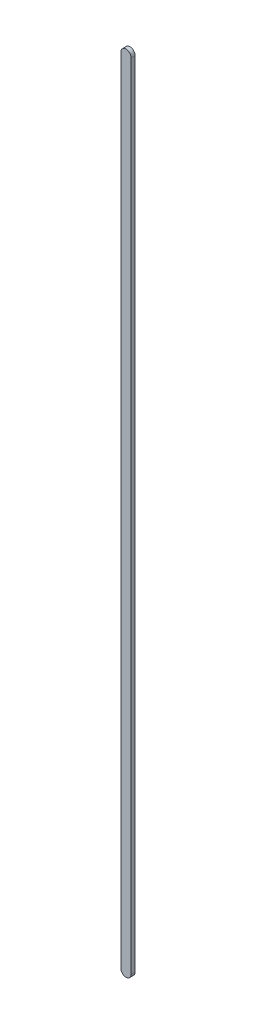
ISO-10303-21;
HEADER;
FILE_DESCRIPTION(('STEP AP214'),'2;1');
FILE_NAME('part.step','',(''),(''),'','','');
FILE_SCHEMA(('AUTOMOTIVE_DESIGN { 1 0 10303 214 1 1 1 1 }'));
ENDSEC;
DATA;
#1=APPLICATION_CONTEXT('core data for automotive mechanical design processes');
#2=APPLICATION_PROTOCOL_DEFINITION('international standard','automotive_design',2000,#1);
#3=PRODUCT_CONTEXT('',#1,'mechanical');
#4=PRODUCT('Part','Part','',(#3));
#5=PRODUCT_RELATED_PRODUCT_CATEGORY('part','',(#4));
#6=PRODUCT_DEFINITION_FORMATION('','',#4);
#7=PRODUCT_DEFINITION_CONTEXT('part definition',#1,'design');
#8=PRODUCT_DEFINITION('design','',#6,#7);
#9=PRODUCT_DEFINITION_SHAPE('','',#8);
#10=(LENGTH_UNIT() NAMED_UNIT(*) SI_UNIT(.MILLI.,.METRE.));
#11=(NAMED_UNIT(*) PLANE_ANGLE_UNIT() SI_UNIT($,.RADIAN.));
#12=(NAMED_UNIT(*) SI_UNIT($,.STERADIAN.) SOLID_ANGLE_UNIT());
#13=UNCERTAINTY_MEASURE_WITH_UNIT(LENGTH_MEASURE(1.E-05),#10,'distance_accuracy_value','');
#14=(GEOMETRIC_REPRESENTATION_CONTEXT(3) GLOBAL_UNCERTAINTY_ASSIGNED_CONTEXT((#13)) GLOBAL_UNIT_ASSIGNED_CONTEXT((#10,
#11,#12)) REPRESENTATION_CONTEXT('',''));
#15=CARTESIAN_POINT('',(0.,0.,0.));
#16=DIRECTION('',(0.,0.,1.));
#17=DIRECTION('',(1.,0.,0.));
#18=AXIS2_PLACEMENT_3D('',#15,#16,#17);
#19=CARTESIAN_POINT('',(86.487,77.724,0.));
#20=DIRECTION('',(-1.,0.,0.));
#21=DIRECTION('',(0.,1.,0.));
#22=AXIS2_PLACEMENT_3D('',#19,#20,#21);
#23=PLANE('',#22);
#24=DIRECTION('',(0.,1.,0.));
#25=VECTOR('',#24,1.);
#26=CARTESIAN_POINT('',(86.487,77.724,0.1999996));
#27=LINE('',#26,#25);
#28=CARTESIAN_POINT('',(86.487,77.724,0.1999996));
#29=VERTEX_POINT('',#28);
#30=CARTESIAN_POINT('',(86.487,117.348,0.1999996));
#31=VERTEX_POINT('',#30);
#32=EDGE_CURVE('E11',#29,#31,#27,.T.);
#33=ORIENTED_EDGE('',*,*,#32,.F.);
#34=DIRECTION('',(0.,0.,1.));
#35=VECTOR('',#34,1.);
#36=CARTESIAN_POINT('',(86.487,77.724,0.));
#37=LINE('',#36,#35);
#38=CARTESIAN_POINT('',(86.487,77.724,0.));
#39=VERTEX_POINT('',#38);
#40=EDGE_CURVE('E24',#39,#29,#37,.T.);
#41=ORIENTED_EDGE('',*,*,#40,.F.);
#42=DIRECTION('',(0.,1.,0.));
#43=VECTOR('',#42,1.);
#44=CARTESIAN_POINT('',(86.487,77.724,0.));
#45=LINE('',#44,#43);
#46=CARTESIAN_POINT('',(86.487,117.348,0.));
#47=VERTEX_POINT('',#46);
#48=EDGE_CURVE('E75',#39,#47,#45,.T.);
#49=ORIENTED_EDGE('',*,*,#48,.T.);
#50=DIRECTION('',(0.,0.,1.));
#51=VECTOR('',#50,1.);
#52=CARTESIAN_POINT('',(86.487,117.348,0.));
#53=LINE('',#52,#51);
#54=EDGE_CURVE('E37',#47,#31,#53,.T.);
#55=ORIENTED_EDGE('',*,*,#54,.T.);
#56=EDGE_LOOP('',(#33,#41,#49,#55));
#57=FACE_BOUND('',#56,.T.);
#58=ADVANCED_FACE('F17',(#57),#23,.F.);
#59=CARTESIAN_POINT('',(86.233,117.348,0.));
#60=DIRECTION('',(0.,0.,-1.));
#61=DIRECTION('',(1.,0.,0.));
#62=AXIS2_PLACEMENT_3D('',#59,#60,#61);
#63=CYLINDRICAL_SURFACE('',#62,0.254);
#64=CARTESIAN_POINT('',(86.233,117.348,0.1999996));
#65=DIRECTION('',(0.,0.,1.));
#66=DIRECTION('',(1.,0.,0.));
#67=AXIS2_PLACEMENT_3D('',#64,#65,#66);
#68=CIRCLE('',#67,0.254);
#69=CARTESIAN_POINT('',(85.979,117.348,0.1999996));
#70=VERTEX_POINT('',#69);
#71=EDGE_CURVE('E83',#31,#70,#68,.T.);
#72=ORIENTED_EDGE('',*,*,#71,.F.);
#73=ORIENTED_EDGE('',*,*,#54,.F.);
#74=CARTESIAN_POINT('',(86.233,117.348,0.));
#75=DIRECTION('',(0.,0.,1.));
#76=DIRECTION('',(1.,0.,0.));
#77=AXIS2_PLACEMENT_3D('',#74,#75,#76);
#78=CIRCLE('',#77,0.254);
#79=CARTESIAN_POINT('',(85.979,117.348,0.));
#80=VERTEX_POINT('',#79);
#81=EDGE_CURVE('E81',#47,#80,#78,.T.);
#82=ORIENTED_EDGE('',*,*,#81,.T.);
#83=DIRECTION('',(0.,0.,1.));
#84=VECTOR('',#83,1.);
#85=CARTESIAN_POINT('',(85.979,117.348,0.));
#86=LINE('',#85,#84);
#87=EDGE_CURVE('E67',#80,#70,#86,.T.);
#88=ORIENTED_EDGE('',*,*,#87,.T.);
#89=EDGE_LOOP('',(#72,#73,#82,#88));
#90=FACE_BOUND('',#89,.T.);
#91=ADVANCED_FACE('F89',(#90),#63,.T.);
#92=CARTESIAN_POINT('',(85.979,117.348,0.));
#93=DIRECTION('',(1.,0.,0.));
#94=DIRECTION('',(0.,-1.,0.));
#95=AXIS2_PLACEMENT_3D('',#92,#93,#94);
#96=PLANE('',#95);
#97=DIRECTION('',(0.,-1.,0.));
#98=VECTOR('',#97,1.);
#99=CARTESIAN_POINT('',(85.979,117.348,0.1999996));
#100=LINE('',#99,#98);
#101=CARTESIAN_POINT('',(85.979,77.724,0.1999996));
#102=VERTEX_POINT('',#101);
#103=EDGE_CURVE('E71',#70,#102,#100,.T.);
#104=ORIENTED_EDGE('',*,*,#103,.F.);
#105=ORIENTED_EDGE('',*,*,#87,.F.);
#106=DIRECTION('',(0.,-1.,0.));
#107=VECTOR('',#106,1.);
#108=CARTESIAN_POINT('',(85.979,117.348,0.));
#109=LINE('',#108,#107);
#110=CARTESIAN_POINT('',(85.979,77.724,0.));
#111=VERTEX_POINT('',#110);
#112=EDGE_CURVE('E63',#80,#111,#109,.T.);
#113=ORIENTED_EDGE('',*,*,#112,.T.);
#114=DIRECTION('',(0.,0.,1.));
#115=VECTOR('',#114,1.);
#116=CARTESIAN_POINT('',(85.979,77.724,0.));
#117=LINE('',#116,#115);
#118=EDGE_CURVE('E53',#111,#102,#117,.T.);
#119=ORIENTED_EDGE('',*,*,#118,.T.);
#120=EDGE_LOOP('',(#104,#105,#113,#119));
#121=FACE_BOUND('',#120,.T.);
#122=ADVANCED_FACE('F66',(#121),#96,.F.);
#123=CARTESIAN_POINT('',(86.233,77.724,0.));
#124=DIRECTION('',(0.,0.,-1.));
#125=DIRECTION('',(-1.,0.,0.));
#126=AXIS2_PLACEMENT_3D('',#123,#124,#125);
#127=CYLINDRICAL_SURFACE('',#126,0.254);
#128=CARTESIAN_POINT('',(86.233,77.724,0.1999996));
#129=DIRECTION('',(0.,0.,1.));
#130=DIRECTION('',(-1.,0.,0.));
#131=AXIS2_PLACEMENT_3D('',#128,#129,#130);
#132=CIRCLE('',#131,0.254);
#133=EDGE_CURVE('E59',#102,#29,#132,.T.);
#134=ORIENTED_EDGE('',*,*,#133,.F.);
#135=ORIENTED_EDGE('',*,*,#118,.F.);
#136=CARTESIAN_POINT('',(86.233,77.724,0.));
#137=DIRECTION('',(0.,0.,1.));
#138=DIRECTION('',(-1.,0.,0.));
#139=AXIS2_PLACEMENT_3D('',#136,#137,#138);
#140=CIRCLE('',#139,0.254);
#141=EDGE_CURVE('E57',#111,#39,#140,.T.);
#142=ORIENTED_EDGE('',*,*,#141,.T.);
#143=ORIENTED_EDGE('',*,*,#40,.T.);
#144=EDGE_LOOP('',(#134,#135,#142,#143));
#145=FACE_BOUND('',#144,.T.);
#146=ADVANCED_FACE('F55',(#145),#127,.T.);
#147=CARTESIAN_POINT('',(86.487,77.724,0.));
#148=DIRECTION('',(0.,0.,-1.));
#149=DIRECTION('',(-1.,0.,0.));
#150=AXIS2_PLACEMENT_3D('',#147,#148,#149);
#151=PLANE('',#150);
#152=ORIENTED_EDGE('',*,*,#141,.F.);
#153=ORIENTED_EDGE('',*,*,#112,.F.);
#154=ORIENTED_EDGE('',*,*,#81,.F.);
#155=ORIENTED_EDGE('',*,*,#48,.F.);
#156=EDGE_LOOP('',(#152,#153,#154,#155));
#157=FACE_BOUND('',#156,.T.);
#158=ADVANCED_FACE('F74',(#157),#151,.T.);
#159=CARTESIAN_POINT('',(86.487,77.724,0.1999996));
#160=DIRECTION('',(0.,0.,-1.));
#161=DIRECTION('',(-1.,0.,0.));
#162=AXIS2_PLACEMENT_3D('',#159,#160,#161);
#163=PLANE('',#162);
#164=ORIENTED_EDGE('',*,*,#32,.T.);
#165=ORIENTED_EDGE('',*,*,#71,.T.);
#166=ORIENTED_EDGE('',*,*,#103,.T.);
#167=ORIENTED_EDGE('',*,*,#133,.T.);
#168=EDGE_LOOP('',(#164,#165,#166,#167));
#169=FACE_BOUND('',#168,.T.);
#170=ADVANCED_FACE('F91',(#169),#163,.F.);
#171=CLOSED_SHELL('',(#58,#91,#122,#146,#158,#170));
#172=MANIFOLD_SOLID_BREP('B1',#171);
#173=ADVANCED_BREP_SHAPE_REPRESENTATION('',(#18,#172),#14);
#174=SHAPE_DEFINITION_REPRESENTATION(#9,#173);
ENDSEC;
END-ISO-10303-21;
